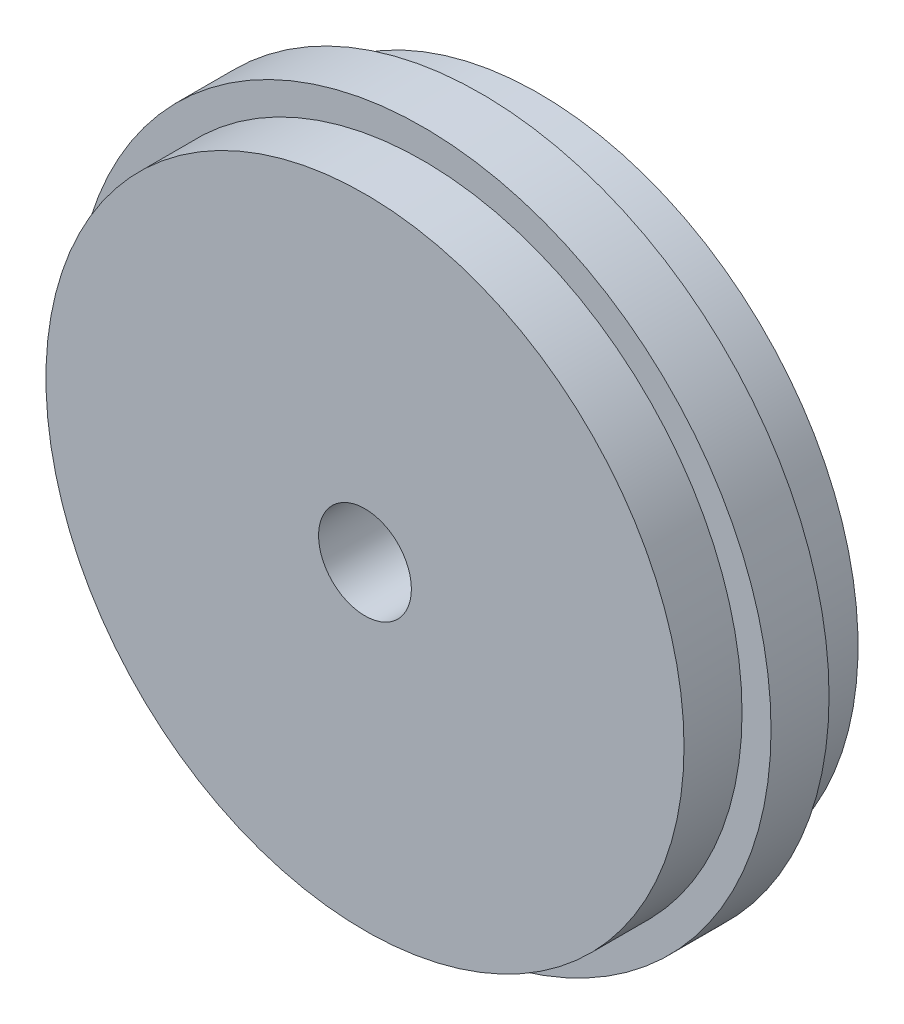
ISO-10303-21;
HEADER;
FILE_DESCRIPTION(('STEP AP214'),'2;1');
FILE_NAME('part.step','',(''),(''),'','','');
FILE_SCHEMA(('AUTOMOTIVE_DESIGN { 1 0 10303 214 1 1 1 1 }'));
ENDSEC;
DATA;
#1=APPLICATION_CONTEXT('core data for automotive mechanical design processes');
#2=APPLICATION_PROTOCOL_DEFINITION('international standard','automotive_design',2000,#1);
#3=PRODUCT_CONTEXT('',#1,'mechanical');
#4=PRODUCT('Part','Part','',(#3));
#5=PRODUCT_RELATED_PRODUCT_CATEGORY('part','',(#4));
#6=PRODUCT_DEFINITION_FORMATION('','',#4);
#7=PRODUCT_DEFINITION_CONTEXT('part definition',#1,'design');
#8=PRODUCT_DEFINITION('design','',#6,#7);
#9=PRODUCT_DEFINITION_SHAPE('','',#8);
#10=(LENGTH_UNIT() NAMED_UNIT(*) SI_UNIT(.MILLI.,.METRE.));
#11=(NAMED_UNIT(*) PLANE_ANGLE_UNIT() SI_UNIT($,.RADIAN.));
#12=(NAMED_UNIT(*) SI_UNIT($,.STERADIAN.) SOLID_ANGLE_UNIT());
#13=UNCERTAINTY_MEASURE_WITH_UNIT(LENGTH_MEASURE(1.E-05),#10,'distance_accuracy_value','');
#14=(GEOMETRIC_REPRESENTATION_CONTEXT(3) GLOBAL_UNCERTAINTY_ASSIGNED_CONTEXT((#13)) GLOBAL_UNIT_ASSIGNED_CONTEXT((#10,
#11,#12)) REPRESENTATION_CONTEXT('',''));
#15=CARTESIAN_POINT('',(0.,0.,0.));
#16=DIRECTION('',(0.,0.,1.));
#17=DIRECTION('',(1.,0.,0.));
#18=AXIS2_PLACEMENT_3D('',#15,#16,#17);
#19=CARTESIAN_POINT('',(0.,0.,10.));
#20=DIRECTION('',(0.,0.,-1.));
#21=DIRECTION('',(-1.,0.,0.));
#22=AXIS2_PLACEMENT_3D('',#19,#20,#21);
#23=CYLINDRICAL_SURFACE('',#22,60.);
#24=CARTESIAN_POINT('',(0.,0.,10.));
#25=DIRECTION('',(0.,0.,1.));
#26=DIRECTION('',(1.,0.,0.));
#27=AXIS2_PLACEMENT_3D('',#24,#25,#26);
#28=CIRCLE('',#27,60.);
#29=CARTESIAN_POINT('',(60.,0.,10.));
#30=VERTEX_POINT('',#29);
#31=EDGE_CURVE('E42',#30,#30,#28,.T.);
#32=ORIENTED_EDGE('',*,*,#31,.F.);
#33=EDGE_LOOP('',(#32));
#34=FACE_BOUND('',#33,.T.);
#35=CARTESIAN_POINT('',(0.,0.,0.));
#36=DIRECTION('',(0.,0.,1.));
#37=DIRECTION('',(1.,0.,0.));
#38=AXIS2_PLACEMENT_3D('',#35,#36,#37);
#39=CIRCLE('',#38,60.);
#40=CARTESIAN_POINT('',(60.,0.,0.));
#41=VERTEX_POINT('',#40);
#42=EDGE_CURVE('E33',#41,#41,#39,.T.);
#43=ORIENTED_EDGE('',*,*,#42,.T.);
#44=EDGE_LOOP('',(#43));
#45=FACE_BOUND('',#44,.T.);
#46=ADVANCED_FACE('F30',(#34,#45),#23,.T.);
#47=CARTESIAN_POINT('',(0.,0.,10.));
#48=DIRECTION('',(0.,0.,1.));
#49=DIRECTION('',(1.,0.,0.));
#50=AXIS2_PLACEMENT_3D('',#47,#48,#49);
#51=PLANE('',#50);
#52=CARTESIAN_POINT('',(0.,0.,10.));
#53=DIRECTION('',(0.,0.,1.));
#54=DIRECTION('',(1.,0.,0.));
#55=AXIS2_PLACEMENT_3D('',#52,#53,#54);
#56=CIRCLE('',#55,55.);
#57=CARTESIAN_POINT('',(55.,0.,10.));
#58=VERTEX_POINT('',#57);
#59=EDGE_CURVE('E37',#58,#58,#56,.T.);
#60=ORIENTED_EDGE('',*,*,#59,.F.);
#61=EDGE_LOOP('',(#60));
#62=FACE_BOUND('',#61,.T.);
#63=ORIENTED_EDGE('',*,*,#31,.T.);
#64=EDGE_LOOP('',(#63));
#65=FACE_BOUND('',#64,.T.);
#66=ADVANCED_FACE('F60',(#62,#65),#51,.T.);
#67=CARTESIAN_POINT('',(0.,0.,0.));
#68=DIRECTION('',(0.,0.,1.));
#69=DIRECTION('',(1.,0.,0.));
#70=AXIS2_PLACEMENT_3D('',#67,#68,#69);
#71=PLANE('',#70);
#72=CARTESIAN_POINT('',(0.,0.,0.));
#73=DIRECTION('',(0.,0.,-1.));
#74=DIRECTION('',(-1.,0.,0.));
#75=AXIS2_PLACEMENT_3D('',#72,#73,#74);
#76=CIRCLE('',#75,55.);
#77=CARTESIAN_POINT('',(-55.,0.,0.));
#78=VERTEX_POINT('',#77);
#79=EDGE_CURVE('E10',#78,#78,#76,.T.);
#80=ORIENTED_EDGE('',*,*,#79,.F.);
#81=EDGE_LOOP('',(#80));
#82=FACE_BOUND('',#81,.T.);
#83=ORIENTED_EDGE('',*,*,#42,.F.);
#84=EDGE_LOOP('',(#83));
#85=FACE_BOUND('',#84,.T.);
#86=ADVANCED_FACE('F57',(#82,#85),#71,.F.);
#87=CARTESIAN_POINT('',(0.,0.,20.));
#88=DIRECTION('',(0.,0.,-1.));
#89=DIRECTION('',(-1.,0.,0.));
#90=AXIS2_PLACEMENT_3D('',#87,#88,#89);
#91=CYLINDRICAL_SURFACE('',#90,55.);
#92=CARTESIAN_POINT('',(0.,0.,20.));
#93=DIRECTION('',(0.,0.,1.));
#94=DIRECTION('',(1.,0.,0.));
#95=AXIS2_PLACEMENT_3D('',#92,#93,#94);
#96=CIRCLE('',#95,55.);
#97=CARTESIAN_POINT('',(55.,0.,20.));
#98=VERTEX_POINT('',#97);
#99=EDGE_CURVE('E48',#98,#98,#96,.T.);
#100=ORIENTED_EDGE('',*,*,#99,.F.);
#101=EDGE_LOOP('',(#100));
#102=FACE_BOUND('',#101,.T.);
#103=ORIENTED_EDGE('',*,*,#59,.T.);
#104=EDGE_LOOP('',(#103));
#105=FACE_BOUND('',#104,.T.);
#106=ADVANCED_FACE('F59',(#102,#105),#91,.T.);
#107=CARTESIAN_POINT('',(0.,0.,20.));
#108=DIRECTION('',(0.,0.,1.));
#109=DIRECTION('',(1.,0.,0.));
#110=AXIS2_PLACEMENT_3D('',#107,#108,#109);
#111=PLANE('',#110);
#112=CARTESIAN_POINT('',(0.,0.,20.));
#113=DIRECTION('',(0.,0.,1.));
#114=DIRECTION('',(1.,0.,0.));
#115=AXIS2_PLACEMENT_3D('',#112,#113,#114);
#116=CIRCLE('',#115,8.);
#117=CARTESIAN_POINT('',(8.,0.,20.));
#118=VERTEX_POINT('',#117);
#119=EDGE_CURVE('E138',#118,#118,#116,.T.);
#120=ORIENTED_EDGE('',*,*,#119,.F.);
#121=EDGE_LOOP('',(#120));
#122=FACE_BOUND('',#121,.T.);
#123=ORIENTED_EDGE('',*,*,#99,.T.);
#124=EDGE_LOOP('',(#123));
#125=FACE_BOUND('',#124,.T.);
#126=ADVANCED_FACE('F66',(#122,#125),#111,.T.);
#127=CARTESIAN_POINT('',(0.,0.,-10.));
#128=DIRECTION('',(0.,0.,1.));
#129=DIRECTION('',(1.,0.,0.));
#130=AXIS2_PLACEMENT_3D('',#127,#128,#129);
#131=CYLINDRICAL_SURFACE('',#130,55.);
#132=CARTESIAN_POINT('',(0.,0.,-10.));
#133=DIRECTION('',(0.,0.,-1.));
#134=DIRECTION('',(-1.,0.,0.));
#135=AXIS2_PLACEMENT_3D('',#132,#133,#134);
#136=CIRCLE('',#135,55.);
#137=CARTESIAN_POINT('',(-55.,0.,-10.));
#138=VERTEX_POINT('',#137);
#139=EDGE_CURVE('E46',#138,#138,#136,.T.);
#140=ORIENTED_EDGE('',*,*,#139,.F.);
#141=EDGE_LOOP('',(#140));
#142=FACE_BOUND('',#141,.T.);
#143=ORIENTED_EDGE('',*,*,#79,.T.);
#144=EDGE_LOOP('',(#143));
#145=FACE_BOUND('',#144,.T.);
#146=ADVANCED_FACE('F96',(#142,#145),#131,.T.);
#147=CARTESIAN_POINT('',(0.,0.,-10.));
#148=DIRECTION('',(0.,0.,-1.));
#149=DIRECTION('',(-1.,0.,0.));
#150=AXIS2_PLACEMENT_3D('',#147,#148,#149);
#151=PLANE('',#150);
#152=CARTESIAN_POINT('',(0.,0.,-10.));
#153=DIRECTION('',(0.,0.,1.));
#154=DIRECTION('',(1.,0.,0.));
#155=AXIS2_PLACEMENT_3D('',#152,#153,#154);
#156=CIRCLE('',#155,8.);
#157=CARTESIAN_POINT('',(8.,0.,-10.));
#158=VERTEX_POINT('',#157);
#159=EDGE_CURVE('E135',#158,#158,#156,.T.);
#160=ORIENTED_EDGE('',*,*,#159,.T.);
#161=EDGE_LOOP('',(#160));
#162=FACE_BOUND('',#161,.T.);
#163=ORIENTED_EDGE('',*,*,#139,.T.);
#164=EDGE_LOOP('',(#163));
#165=FACE_BOUND('',#164,.T.);
#166=ADVANCED_FACE('F101',(#162,#165),#151,.T.);
#167=CARTESIAN_POINT('',(0.,0.,-10.));
#168=DIRECTION('',(0.,0.,1.));
#169=DIRECTION('',(1.,0.,0.));
#170=AXIS2_PLACEMENT_3D('',#167,#168,#169);
#171=CYLINDRICAL_SURFACE('',#170,8.);
#172=ORIENTED_EDGE('',*,*,#159,.F.);
#173=EDGE_LOOP('',(#172));
#174=FACE_BOUND('',#173,.T.);
#175=ORIENTED_EDGE('',*,*,#119,.T.);
#176=EDGE_LOOP('',(#175));
#177=FACE_BOUND('',#176,.T.);
#178=ADVANCED_FACE('F118',(#174,#177),#171,.F.);
#179=CLOSED_SHELL('',(#46,#66,#86,#106,#126,#146,#166,#178));
#180=MANIFOLD_SOLID_BREP('B2',#179);
#181=ADVANCED_BREP_SHAPE_REPRESENTATION('',(#18,#180),#14);
#182=SHAPE_DEFINITION_REPRESENTATION(#9,#181);
ENDSEC;
END-ISO-10303-21;
